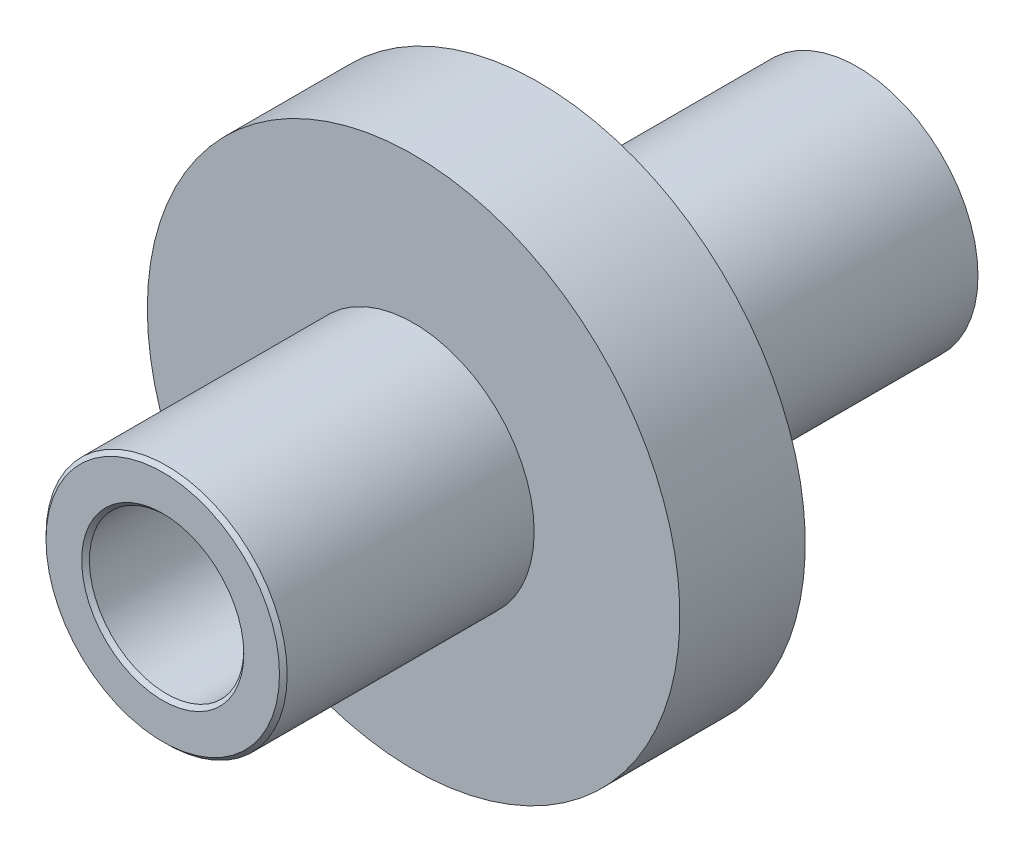
ISO-10303-21;
HEADER;
FILE_DESCRIPTION(('STEP AP214'),'2;1');
FILE_NAME('part.step','',(''),(''),'','','');
FILE_SCHEMA(('AUTOMOTIVE_DESIGN { 1 0 10303 214 1 1 1 1 }'));
ENDSEC;
DATA;
#1=APPLICATION_CONTEXT('core data for automotive mechanical design processes');
#2=APPLICATION_PROTOCOL_DEFINITION('international standard','automotive_design',2000,#1);
#3=PRODUCT_CONTEXT('',#1,'mechanical');
#4=PRODUCT('Part','Part','',(#3));
#5=PRODUCT_RELATED_PRODUCT_CATEGORY('part','',(#4));
#6=PRODUCT_DEFINITION_FORMATION('','',#4);
#7=PRODUCT_DEFINITION_CONTEXT('part definition',#1,'design');
#8=PRODUCT_DEFINITION('design','',#6,#7);
#9=PRODUCT_DEFINITION_SHAPE('','',#8);
#10=(LENGTH_UNIT() NAMED_UNIT(*) SI_UNIT(.MILLI.,.METRE.));
#11=(NAMED_UNIT(*) PLANE_ANGLE_UNIT() SI_UNIT($,.RADIAN.));
#12=(NAMED_UNIT(*) SI_UNIT($,.STERADIAN.) SOLID_ANGLE_UNIT());
#13=UNCERTAINTY_MEASURE_WITH_UNIT(LENGTH_MEASURE(1.E-05),#10,'distance_accuracy_value','');
#14=(GEOMETRIC_REPRESENTATION_CONTEXT(3) GLOBAL_UNCERTAINTY_ASSIGNED_CONTEXT((#13)) GLOBAL_UNIT_ASSIGNED_CONTEXT((#10,
#11,#12)) REPRESENTATION_CONTEXT('',''));
#15=CARTESIAN_POINT('',(0.,0.,0.));
#16=DIRECTION('',(0.,0.,1.));
#17=DIRECTION('',(1.,0.,0.));
#18=AXIS2_PLACEMENT_3D('',#15,#16,#17);
#19=CARTESIAN_POINT('',(0.,0.,6.5));
#20=DIRECTION('',(0.,0.,1.));
#21=DIRECTION('',(1.,0.,0.));
#22=AXIS2_PLACEMENT_3D('',#19,#20,#21);
#23=PLANE('',#22);
#24=CARTESIAN_POINT('',(0.,0.,6.5));
#25=DIRECTION('',(0.,0.,1.));
#26=DIRECTION('',(1.,0.,0.));
#27=AXIS2_PLACEMENT_3D('',#24,#25,#26);
#28=CIRCLE('',#27,6.25);
#29=CARTESIAN_POINT('',(6.25,0.,6.5));
#30=VERTEX_POINT('',#29);
#31=EDGE_CURVE('E103',#30,#30,#28,.T.);
#32=ORIENTED_EDGE('',*,*,#31,.F.);
#33=EDGE_LOOP('',(#32));
#34=FACE_BOUND('',#33,.T.);
#35=CARTESIAN_POINT('',(0.,0.,6.5));
#36=DIRECTION('',(0.,0.,1.));
#37=DIRECTION('',(1.,0.,0.));
#38=AXIS2_PLACEMENT_3D('',#35,#36,#37);
#39=CIRCLE('',#38,13.8);
#40=CARTESIAN_POINT('',(-13.8,0.,6.5));
#41=VERTEX_POINT('',#40);
#42=EDGE_CURVE('E107',#41,#41,#39,.T.);
#43=ORIENTED_EDGE('',*,*,#42,.T.);
#44=EDGE_LOOP('',(#43));
#45=FACE_BOUND('',#44,.T.);
#46=ADVANCED_FACE('F36',(#34,#45),#23,.T.);
#47=CARTESIAN_POINT('',(0.,0.,0.));
#48=DIRECTION('',(0.,0.,1.));
#49=DIRECTION('',(1.,0.,0.));
#50=AXIS2_PLACEMENT_3D('',#47,#48,#49);
#51=PLANE('',#50);
#52=CARTESIAN_POINT('',(0.,0.,0.));
#53=DIRECTION('',(0.,0.,1.));
#54=DIRECTION('',(1.,0.,0.));
#55=AXIS2_PLACEMENT_3D('',#52,#53,#54);
#56=CIRCLE('',#55,6.25);
#57=CARTESIAN_POINT('',(6.25,0.,0.));
#58=VERTEX_POINT('',#57);
#59=EDGE_CURVE('E102',#58,#58,#56,.T.);
#60=ORIENTED_EDGE('',*,*,#59,.T.);
#61=EDGE_LOOP('',(#60));
#62=FACE_BOUND('',#61,.T.);
#63=CARTESIAN_POINT('',(0.,0.,0.));
#64=DIRECTION('',(0.,0.,1.));
#65=DIRECTION('',(1.,0.,0.));
#66=AXIS2_PLACEMENT_3D('',#63,#64,#65);
#67=CIRCLE('',#66,13.8);
#68=CARTESIAN_POINT('',(-13.8,0.,0.));
#69=VERTEX_POINT('',#68);
#70=EDGE_CURVE('E110',#69,#69,#67,.T.);
#71=ORIENTED_EDGE('',*,*,#70,.F.);
#72=EDGE_LOOP('',(#71));
#73=FACE_BOUND('',#72,.T.);
#74=ADVANCED_FACE('F150',(#62,#73),#51,.F.);
#75=CARTESIAN_POINT('',(0.,0.,6.5));
#76=DIRECTION('',(0.,0.,-1.));
#77=DIRECTION('',(-1.,0.,0.));
#78=AXIS2_PLACEMENT_3D('',#75,#76,#77);
#79=CYLINDRICAL_SURFACE('',#78,13.8);
#80=CARTESIAN_POINT('',(-13.8,0.,6.5));
#81=CARTESIAN_POINT('',(-13.8,0.,6.43229166666667));
#82=CARTESIAN_POINT('',(-13.8,0.,6.36458333333333));
#83=CARTESIAN_POINT('',(-13.8,0.,6.22916666666667));
#84=CARTESIAN_POINT('',(-13.8,0.,6.16145833333333));
#85=CARTESIAN_POINT('',(-13.8,0.,6.02604166666667));
#86=CARTESIAN_POINT('',(-13.8,0.,5.95833333333333));
#87=CARTESIAN_POINT('',(-13.8,0.,5.82291666666667));
#88=CARTESIAN_POINT('',(-13.8,0.,5.75520833333333));
#89=CARTESIAN_POINT('',(-13.8,0.,5.61979166666667));
#90=CARTESIAN_POINT('',(-13.8,0.,5.55208333333333));
#91=CARTESIAN_POINT('',(-13.8,0.,5.41666666666667));
#92=CARTESIAN_POINT('',(-13.8,0.,5.34895833333333));
#93=CARTESIAN_POINT('',(-13.8,0.,5.21354166666667));
#94=CARTESIAN_POINT('',(-13.8,0.,5.14583333333333));
#95=CARTESIAN_POINT('',(-13.8,0.,5.01041666666667));
#96=CARTESIAN_POINT('',(-13.8,0.,4.94270833333333));
#97=CARTESIAN_POINT('',(-13.8,0.,4.80729166666667));
#98=CARTESIAN_POINT('',(-13.8,0.,4.73958333333333));
#99=CARTESIAN_POINT('',(-13.8,0.,4.60416666666667));
#100=CARTESIAN_POINT('',(-13.8,0.,4.53645833333333));
#101=CARTESIAN_POINT('',(-13.8,0.,4.40104166666667));
#102=CARTESIAN_POINT('',(-13.8,0.,4.33333333333333));
#103=CARTESIAN_POINT('',(-13.8,0.,4.19791666666667));
#104=CARTESIAN_POINT('',(-13.8,0.,4.13020833333333));
#105=CARTESIAN_POINT('',(-13.8,0.,3.99479166666667));
#106=CARTESIAN_POINT('',(-13.8,0.,3.92708333333333));
#107=CARTESIAN_POINT('',(-13.8,0.,3.79166666666667));
#108=CARTESIAN_POINT('',(-13.8,0.,3.72395833333333));
#109=CARTESIAN_POINT('',(-13.8,0.,3.58854166666667));
#110=CARTESIAN_POINT('',(-13.8,0.,3.52083333333333));
#111=CARTESIAN_POINT('',(-13.8,0.,3.38541666666667));
#112=CARTESIAN_POINT('',(-13.8,0.,3.31770833333333));
#113=CARTESIAN_POINT('',(-13.8,0.,3.18229166666667));
#114=CARTESIAN_POINT('',(-13.8,0.,3.11458333333333));
#115=CARTESIAN_POINT('',(-13.8,0.,2.97916666666667));
#116=CARTESIAN_POINT('',(-13.8,0.,2.91145833333333));
#117=CARTESIAN_POINT('',(-13.8,0.,2.77604166666667));
#118=CARTESIAN_POINT('',(-13.8,0.,2.70833333333333));
#119=CARTESIAN_POINT('',(-13.8,0.,2.57291666666667));
#120=CARTESIAN_POINT('',(-13.8,0.,2.50520833333333));
#121=CARTESIAN_POINT('',(-13.8,0.,2.36979166666667));
#122=CARTESIAN_POINT('',(-13.8,0.,2.30208333333333));
#123=CARTESIAN_POINT('',(-13.8,0.,2.16666666666667));
#124=CARTESIAN_POINT('',(-13.8,0.,2.09895833333333));
#125=CARTESIAN_POINT('',(-13.8,0.,1.96354166666667));
#126=CARTESIAN_POINT('',(-13.8,0.,1.89583333333333));
#127=CARTESIAN_POINT('',(-13.8,0.,1.76041666666667));
#128=CARTESIAN_POINT('',(-13.8,0.,1.69270833333333));
#129=CARTESIAN_POINT('',(-13.8,0.,1.55729166666667));
#130=CARTESIAN_POINT('',(-13.8,0.,1.48958333333333));
#131=CARTESIAN_POINT('',(-13.8,0.,1.35416666666667));
#132=CARTESIAN_POINT('',(-13.8,0.,1.28645833333333));
#133=CARTESIAN_POINT('',(-13.8,0.,1.15104166666667));
#134=CARTESIAN_POINT('',(-13.8,0.,1.08333333333333));
#135=CARTESIAN_POINT('',(-13.8,0.,0.947916666666667));
#136=CARTESIAN_POINT('',(-13.8,0.,0.880208333333333));
#137=CARTESIAN_POINT('',(-13.8,0.,0.744791666666667));
#138=CARTESIAN_POINT('',(-13.8,0.,0.677083333333333));
#139=CARTESIAN_POINT('',(-13.8,0.,0.541666666666667));
#140=CARTESIAN_POINT('',(-13.8,0.,0.473958333333333));
#141=CARTESIAN_POINT('',(-13.8,0.,0.338541666666667));
#142=CARTESIAN_POINT('',(-13.8,0.,0.270833333333334));
#143=CARTESIAN_POINT('',(-13.8,0.,0.135416666666667));
#144=CARTESIAN_POINT('',(-13.8,0.,0.0677083333333334));
#145=CARTESIAN_POINT('',(-13.8,0.,0.));
#146=B_SPLINE_CURVE_WITH_KNOTS('',3,(#80,#81,#82,#83,#84,#85,#86,#87,#88,#89,#90,#91,#92,#93,
#94,#95,#96,#97,#98,#99,#100,#101,#102,#103,#104,#105,#106,#107,#108,#109,#110,#111,#112,#113,
#114,#115,#116,#117,#118,#119,#120,#121,#122,#123,#124,#125,#126,#127,#128,#129,#130,#131,#132,
#133,#134,#135,#136,#137,#138,#139,#140,#141,#142,#143,#144,#145),.UNSPECIFIED.,.F.,.F.,(4,2,2,
2,2,2,2,2,2,2,2,2,2,2,2,2,2,2,2,2,2,2,2,2,2,2,2,2,2,2,2,2,4),(0.,0.203124999999999,0.40625,
0.609375,0.812499999999999,1.015625,1.21875,1.421875,1.625,1.828125,2.03125,2.234375,2.4375,
2.640625,2.84375,3.046875,3.25,3.453125,3.65625,3.859375,4.0625,4.265625,4.46875,4.671875,4.875,
5.078125,5.28125,5.484375,5.6875,5.890625,6.09375,6.296875,6.5),.UNSPECIFIED.);
#147=EDGE_CURVE('BSEAM146',#41,#69,#146,.T.);
#148=ORIENTED_EDGE('',*,*,#42,.F.);
#149=ORIENTED_EDGE('',*,*,#70,.T.);
#150=ORIENTED_EDGE('',*,*,#147,.T.);
#151=ORIENTED_EDGE('',*,*,#147,.F.);
#152=EDGE_LOOP('',(#148,#150,#149,#151));
#153=FACE_BOUND('',#152,.T.);
#154=ADVANCED_FACE('F146',(#153),#79,.T.);
#155=CARTESIAN_POINT('',(0.,0.,-16.5));
#156=DIRECTION('',(0.,0.,1.));
#157=DIRECTION('',(1.,0.,0.));
#158=AXIS2_PLACEMENT_3D('',#155,#156,#157);
#159=CYLINDRICAL_SURFACE('',#158,6.25);
#160=CARTESIAN_POINT('',(0.,0.,-16.5));
#161=DIRECTION('',(0.,0.,1.));
#162=DIRECTION('',(1.,0.,0.));
#163=AXIS2_PLACEMENT_3D('',#160,#161,#162);
#164=CIRCLE('',#163,6.25);
#165=CARTESIAN_POINT('',(6.25,0.,-16.5));
#166=VERTEX_POINT('',#165);
#167=EDGE_CURVE('E98',#166,#166,#164,.T.);
#168=ORIENTED_EDGE('',*,*,#167,.T.);
#169=EDGE_LOOP('',(#168));
#170=FACE_BOUND('',#169,.T.);
#171=ORIENTED_EDGE('',*,*,#59,.F.);
#172=EDGE_LOOP('',(#171));
#173=FACE_BOUND('',#172,.T.);
#174=ADVANCED_FACE('F149',(#170,#173),#159,.T.);
#175=CARTESIAN_POINT('',(0.,0.,-16.5));
#176=DIRECTION('',(0.,0.,1.));
#177=DIRECTION('',(1.,0.,0.));
#178=AXIS2_PLACEMENT_3D('',#175,#176,#177);
#179=PLANE('',#178);
#180=DIRECTION('',(1.,0.,0.));
#181=VECTOR('',#180,1.);
#182=CARTESIAN_POINT('',(3.46410161513775,-2.2,-16.5));
#183=LINE('',#182,#181);
#184=CARTESIAN_POINT('',(-3.57770876399966,-2.2,-16.5));
#185=VERTEX_POINT('',#184);
#186=CARTESIAN_POINT('',(3.57770876399966,-2.2,-16.5));
#187=VERTEX_POINT('',#186);
#188=EDGE_CURVE('E57',#185,#187,#183,.T.);
#189=ORIENTED_EDGE('',*,*,#188,.T.);
#190=CARTESIAN_POINT('',(0.,0.,-16.5));
#191=DIRECTION('',(0.,0.,1.));
#192=DIRECTION('',(1.,0.,0.));
#193=AXIS2_PLACEMENT_3D('',#190,#191,#192);
#194=CIRCLE('',#193,4.2);
#195=EDGE_CURVE('E50',#187,#185,#194,.T.);
#196=ORIENTED_EDGE('',*,*,#195,.T.);
#197=EDGE_LOOP('',(#189,#196));
#198=FACE_BOUND('',#197,.T.);
#199=ORIENTED_EDGE('',*,*,#167,.F.);
#200=EDGE_LOOP('',(#199));
#201=FACE_BOUND('',#200,.T.);
#202=ADVANCED_FACE('F161',(#198,#201),#179,.F.);
#203=CARTESIAN_POINT('',(0.,0.,6.5));
#204=DIRECTION('',(0.,0.,-1.));
#205=DIRECTION('',(-1.,0.,0.));
#206=AXIS2_PLACEMENT_3D('',#203,#204,#205);
#207=CYLINDRICAL_SURFACE('',#206,4.);
#208=CARTESIAN_POINT('',(0.,0.,19.3));
#209=DIRECTION('',(0.,0.,1.));
#210=DIRECTION('',(1.,0.,0.));
#211=AXIS2_PLACEMENT_3D('',#208,#209,#210);
#212=CIRCLE('',#211,4.);
#213=CARTESIAN_POINT('',(4.,0.,19.3));
#214=VERTEX_POINT('',#213);
#215=EDGE_CURVE('E125',#214,#214,#212,.T.);
#216=ORIENTED_EDGE('',*,*,#215,.T.);
#217=EDGE_LOOP('',(#216));
#218=FACE_BOUND('',#217,.T.);
#219=DIRECTION('',(0.,0.,-1.));
#220=VECTOR('',#219,1.);
#221=CARTESIAN_POINT('',(-3.46410161513775,-2.,-8.5));
#222=LINE('',#221,#220);
#223=CARTESIAN_POINT('',(-3.46410161513775,-2.,-8.5));
#224=VERTEX_POINT('',#223);
#225=CARTESIAN_POINT('',(-3.46410161513775,-2.,-16.3));
#226=VERTEX_POINT('',#225);
#227=EDGE_CURVE('E79',#224,#226,#222,.T.);
#228=ORIENTED_EDGE('',*,*,#227,.T.);
#229=CARTESIAN_POINT('',(0.,0.,-16.3));
#230=DIRECTION('',(0.,0.,1.));
#231=DIRECTION('',(1.,0.,0.));
#232=AXIS2_PLACEMENT_3D('',#229,#230,#231);
#233=CIRCLE('',#232,4.);
#234=CARTESIAN_POINT('',(3.46410161513775,-2.,-16.3));
#235=VERTEX_POINT('',#234);
#236=EDGE_CURVE('E123',#226,#235,#233,.F.);
#237=ORIENTED_EDGE('',*,*,#236,.T.);
#238=DIRECTION('',(0.,0.,-1.));
#239=VECTOR('',#238,1.);
#240=CARTESIAN_POINT('',(3.46410161513775,-2.,-8.5));
#241=LINE('',#240,#239);
#242=CARTESIAN_POINT('',(3.46410161513775,-2.,-8.5));
#243=VERTEX_POINT('',#242);
#244=EDGE_CURVE('E89',#243,#235,#241,.T.);
#245=ORIENTED_EDGE('',*,*,#244,.F.);
#246=CARTESIAN_POINT('',(0.,0.,-8.5));
#247=DIRECTION('',(0.,0.,-1.));
#248=DIRECTION('',(-1.,0.,0.));
#249=AXIS2_PLACEMENT_3D('',#246,#247,#248);
#250=CIRCLE('',#249,4.);
#251=EDGE_CURVE('E93',#243,#224,#250,.T.);
#252=ORIENTED_EDGE('',*,*,#251,.T.);
#253=EDGE_LOOP('',(#228,#237,#245,#252));
#254=FACE_BOUND('',#253,.T.);
#255=ADVANCED_FACE('F95',(#218,#254),#207,.F.);
#256=CARTESIAN_POINT('',(0.,0.,19.3));
#257=DIRECTION('',(0.,0.,1.));
#258=DIRECTION('',(1.,0.,0.));
#259=AXIS2_PLACEMENT_3D('',#256,#257,#258);
#260=CIRCLE('',#259,6.25);
#261=CARTESIAN_POINT('',(6.25,0.,19.3));
#262=VERTEX_POINT('',#261);
#263=EDGE_CURVE('E120',#262,#262,#260,.F.);
#264=ORIENTED_EDGE('',*,*,#263,.T.);
#265=EDGE_LOOP('',(#264));
#266=FACE_BOUND('',#265,.T.);
#267=ORIENTED_EDGE('',*,*,#31,.T.);
#268=EDGE_LOOP('',(#267));
#269=FACE_BOUND('',#268,.T.);
#270=ADVANCED_FACE('F160',(#266,#269),#159,.T.);
#271=CARTESIAN_POINT('',(0.,0.,19.5));
#272=DIRECTION('',(0.,0.,1.));
#273=DIRECTION('',(1.,0.,0.));
#274=AXIS2_PLACEMENT_3D('',#271,#272,#273);
#275=PLANE('',#274);
#276=CARTESIAN_POINT('',(0.,0.,19.5));
#277=DIRECTION('',(0.,0.,1.));
#278=DIRECTION('',(1.,0.,0.));
#279=AXIS2_PLACEMENT_3D('',#276,#277,#278);
#280=CIRCLE('',#279,6.05000000000001);
#281=CARTESIAN_POINT('',(6.05000000000001,0.,19.5));
#282=VERTEX_POINT('',#281);
#283=EDGE_CURVE('E117',#282,#282,#280,.T.);
#284=ORIENTED_EDGE('',*,*,#283,.T.);
#285=EDGE_LOOP('',(#284));
#286=FACE_BOUND('',#285,.T.);
#287=CARTESIAN_POINT('',(0.,0.,19.5));
#288=DIRECTION('',(0.,0.,1.));
#289=DIRECTION('',(1.,0.,0.));
#290=AXIS2_PLACEMENT_3D('',#287,#288,#289);
#291=CIRCLE('',#290,4.20000000000004);
#292=CARTESIAN_POINT('',(4.20000000000004,0.,19.5));
#293=VERTEX_POINT('',#292);
#294=EDGE_CURVE('E106',#293,#293,#291,.F.);
#295=ORIENTED_EDGE('',*,*,#294,.T.);
#296=EDGE_LOOP('',(#295));
#297=FACE_BOUND('',#296,.T.);
#298=ADVANCED_FACE('F165',(#286,#297),#275,.T.);
#299=CARTESIAN_POINT('',(3.46410161513775,-2.,-8.5));
#300=DIRECTION('',(0.,1.,0.));
#301=DIRECTION('',(0.,0.,1.));
#302=AXIS2_PLACEMENT_3D('',#299,#300,#301);
#303=PLANE('',#302);
#304=ORIENTED_EDGE('',*,*,#244,.T.);
#305=DIRECTION('',(-1.,0.,0.));
#306=VECTOR('',#305,1.);
#307=CARTESIAN_POINT('',(-3.46410161513775,-2.,-16.3));
#308=LINE('',#307,#306);
#309=EDGE_CURVE('E11',#235,#226,#308,.T.);
#310=ORIENTED_EDGE('',*,*,#309,.T.);
#311=ORIENTED_EDGE('',*,*,#227,.F.);
#312=DIRECTION('',(1.,0.,0.));
#313=VECTOR('',#312,1.);
#314=CARTESIAN_POINT('',(3.46410161513775,-2.,-8.5));
#315=LINE('',#314,#313);
#316=EDGE_CURVE('E83',#224,#243,#315,.T.);
#317=ORIENTED_EDGE('',*,*,#316,.T.);
#318=EDGE_LOOP('',(#304,#310,#311,#317));
#319=FACE_BOUND('',#318,.T.);
#320=ADVANCED_FACE('F82',(#319),#303,.T.);
#321=CARTESIAN_POINT('',(0.,0.,-8.5));
#322=DIRECTION('',(0.,0.,-1.));
#323=DIRECTION('',(-1.,0.,0.));
#324=AXIS2_PLACEMENT_3D('',#321,#322,#323);
#325=PLANE('',#324);
#326=ORIENTED_EDGE('',*,*,#251,.F.);
#327=ORIENTED_EDGE('',*,*,#316,.F.);
#328=EDGE_LOOP('',(#326,#327));
#329=FACE_BOUND('',#328,.T.);
#330=ADVANCED_FACE('F92',(#329),#325,.F.);
#331=CARTESIAN_POINT('',(0.,0.,19.5));
#332=DIRECTION('',(0.,0.,-1.));
#333=DIRECTION('',(-1.,0.,0.));
#334=AXIS2_PLACEMENT_3D('',#331,#332,#333);
#335=CONICAL_SURFACE('',#334,6.05000000000001,0.785398163397455);
#336=ORIENTED_EDGE('',*,*,#263,.F.);
#337=EDGE_LOOP('',(#336));
#338=FACE_BOUND('',#337,.T.);
#339=ORIENTED_EDGE('',*,*,#283,.F.);
#340=EDGE_LOOP('',(#339));
#341=FACE_BOUND('',#340,.T.);
#342=ADVANCED_FACE('F141',(#338,#341),#335,.T.);
#343=CARTESIAN_POINT('',(0.,0.,19.3));
#344=DIRECTION('',(0.,0.,1.));
#345=DIRECTION('',(1.,0.,0.));
#346=AXIS2_PLACEMENT_3D('',#343,#344,#345);
#347=CONICAL_SURFACE('',#346,4.,0.785398163397446);
#348=CARTESIAN_POINT('',(4.20000000000004,0.,19.5));
#349=CARTESIAN_POINT('',(4.19791666666671,0.,19.4979166666667));
#350=CARTESIAN_POINT('',(4.19583333333337,0.,19.4958333333333));
#351=CARTESIAN_POINT('',(4.19166666666671,0.,19.4916666666667));
#352=CARTESIAN_POINT('',(4.18958333333337,0.,19.4895833333333));
#353=CARTESIAN_POINT('',(4.1854166666667,0.,19.4854166666667));
#354=CARTESIAN_POINT('',(4.18333333333337,0.,19.4833333333333));
#355=CARTESIAN_POINT('',(4.1791666666667,0.,19.4791666666667));
#356=CARTESIAN_POINT('',(4.17708333333337,0.,19.4770833333333));
#357=CARTESIAN_POINT('',(4.1729166666667,0.,19.4729166666667));
#358=CARTESIAN_POINT('',(4.17083333333337,0.,19.4708333333333));
#359=CARTESIAN_POINT('',(4.1666666666667,0.,19.4666666666667));
#360=CARTESIAN_POINT('',(4.16458333333337,0.,19.4645833333333));
#361=CARTESIAN_POINT('',(4.1604166666667,0.,19.4604166666667));
#362=CARTESIAN_POINT('',(4.15833333333337,0.,19.4583333333333));
#363=CARTESIAN_POINT('',(4.1541666666667,0.,19.4541666666667));
#364=CARTESIAN_POINT('',(4.15208333333336,0.,19.4520833333333));
#365=CARTESIAN_POINT('',(4.1479166666667,0.,19.4479166666667));
#366=CARTESIAN_POINT('',(4.14583333333336,0.,19.4458333333333));
#367=CARTESIAN_POINT('',(4.1416666666667,0.,19.4416666666667));
#368=CARTESIAN_POINT('',(4.13958333333336,0.,19.4395833333333));
#369=CARTESIAN_POINT('',(4.13541666666669,0.,19.4354166666667));
#370=CARTESIAN_POINT('',(4.13333333333336,0.,19.4333333333333));
#371=CARTESIAN_POINT('',(4.12916666666669,0.,19.4291666666666));
#372=CARTESIAN_POINT('',(4.12708333333336,0.,19.4270833333333));
#373=CARTESIAN_POINT('',(4.12291666666669,0.,19.4229166666666));
#374=CARTESIAN_POINT('',(4.12083333333336,0.,19.4208333333333));
#375=CARTESIAN_POINT('',(4.11666666666669,0.,19.4166666666666));
#376=CARTESIAN_POINT('',(4.11458333333336,0.,19.4145833333333));
#377=CARTESIAN_POINT('',(4.11041666666669,0.,19.4104166666666));
#378=CARTESIAN_POINT('',(4.10833333333335,0.,19.4083333333333));
#379=CARTESIAN_POINT('',(4.10416666666669,0.,19.4041666666666));
#380=CARTESIAN_POINT('',(4.10208333333335,0.,19.4020833333333));
#381=CARTESIAN_POINT('',(4.09791666666669,0.,19.3979166666666));
#382=CARTESIAN_POINT('',(4.09583333333335,0.,19.3958333333333));
#383=CARTESIAN_POINT('',(4.09166666666668,0.,19.3916666666666));
#384=CARTESIAN_POINT('',(4.08958333333335,0.,19.3895833333333));
#385=CARTESIAN_POINT('',(4.08541666666668,0.,19.3854166666666));
#386=CARTESIAN_POINT('',(4.08333333333335,0.,19.3833333333333));
#387=CARTESIAN_POINT('',(4.07916666666668,0.,19.3791666666666));
#388=CARTESIAN_POINT('',(4.07708333333335,0.,19.3770833333333));
#389=CARTESIAN_POINT('',(4.07291666666668,0.,19.3729166666666));
#390=CARTESIAN_POINT('',(4.07083333333335,0.,19.3708333333333));
#391=CARTESIAN_POINT('',(4.06666666666668,0.,19.3666666666666));
#392=CARTESIAN_POINT('',(4.06458333333335,0.,19.3645833333333));
#393=CARTESIAN_POINT('',(4.06041666666668,0.,19.3604166666666));
#394=CARTESIAN_POINT('',(4.05833333333334,0.,19.3583333333333));
#395=CARTESIAN_POINT('',(4.05416666666668,0.,19.3541666666666));
#396=CARTESIAN_POINT('',(4.05208333333334,0.,19.3520833333333));
#397=CARTESIAN_POINT('',(4.04791666666668,0.,19.3479166666666));
#398=CARTESIAN_POINT('',(4.04583333333334,0.,19.3458333333333));
#399=CARTESIAN_POINT('',(4.04166666666667,0.,19.3416666666666));
#400=CARTESIAN_POINT('',(4.03958333333334,0.,19.3395833333333));
#401=CARTESIAN_POINT('',(4.03541666666667,0.,19.3354166666666));
#402=CARTESIAN_POINT('',(4.03333333333334,0.,19.3333333333333));
#403=CARTESIAN_POINT('',(4.02916666666667,0.,19.3291666666666));
#404=CARTESIAN_POINT('',(4.02708333333334,0.,19.3270833333333));
#405=CARTESIAN_POINT('',(4.02291666666667,0.,19.3229166666666));
#406=CARTESIAN_POINT('',(4.02083333333334,0.,19.3208333333333));
#407=CARTESIAN_POINT('',(4.01666666666667,0.,19.3166666666666));
#408=CARTESIAN_POINT('',(4.01458333333334,0.,19.3145833333333));
#409=CARTESIAN_POINT('',(4.01041666666667,0.,19.3104166666666));
#410=CARTESIAN_POINT('',(4.00833333333333,0.,19.3083333333333));
#411=CARTESIAN_POINT('',(4.00416666666667,0.,19.3041666666666));
#412=CARTESIAN_POINT('',(4.00208333333333,0.,19.3020833333333));
#413=CARTESIAN_POINT('',(4.,0.,19.3));
#414=B_SPLINE_CURVE_WITH_KNOTS('',3,(#348,#349,#350,#351,#352,#353,#354,#355,#356,#357,#358,
#359,#360,#361,#362,#363,#364,#365,#366,#367,#368,#369,#370,#371,#372,#373,#374,#375,#376,#377,
#378,#379,#380,#381,#382,#383,#384,#385,#386,#387,#388,#389,#390,#391,#392,#393,#394,#395,#396,
#397,#398,#399,#400,#401,#402,#403,#404,#405,#406,#407,#408,#409,#410,#411,#412,#413),
.UNSPECIFIED.,.F.,.F.,(4,2,2,2,2,2,2,2,2,2,2,2,2,2,2,2,2,2,2,2,2,2,2,2,2,2,2,2,2,2,2,2,4),(0.,
0.00883883476483455,0.0176776695296697,0.0265165042945018,0.0353553390593364,0.0441941738241691,
0.0530330085890036,0.0618718433538382,0.0707106781186709,0.0795495128835054,0.0883883476483375,
0.0972271824131727,0.106066017178007,0.114904851942839,0.123743686707674,0.132582521472507,
0.141421356237341,0.150260191002176,0.159099025767008,0.167937860531844,0.176776695296676,
0.18561553006151,0.194454364826345,0.203293199591177,0.212132034356012,0.220970869120845,
0.229809703885679,0.238648538650514,0.247487373415347,0.256326208180181,0.265165042945013,
0.274003877709848,0.28284271247468),.UNSPECIFIED.);
#415=EDGE_CURVE('BSEAM137',#293,#214,#414,.T.);
#416=ORIENTED_EDGE('',*,*,#294,.F.);
#417=ORIENTED_EDGE('',*,*,#215,.F.);
#418=ORIENTED_EDGE('',*,*,#415,.T.);
#419=ORIENTED_EDGE('',*,*,#415,.F.);
#420=EDGE_LOOP('',(#416,#418,#417,#419));
#421=FACE_BOUND('',#420,.T.);
#422=ADVANCED_FACE('F137',(#421),#347,.F.);
#423=CARTESIAN_POINT('',(0.,-2.2,-16.5));
#424=DIRECTION('',(0.,0.707106781186548,-0.707106781186548));
#425=DIRECTION('',(-1.,0.,0.));
#426=AXIS2_PLACEMENT_3D('',#423,#424,#425);
#427=PLANE('',#426);
#428=CARTESIAN_POINT('',(-3.57770876399966,-2.2,-16.5));
#429=CARTESIAN_POINT('',(-3.55903726849498,-2.16659196899255,-16.4665919689926));
#430=CARTESIAN_POINT('',(-3.54023426015984,-2.13322128997931,-16.4332212899793));
#431=CARTESIAN_POINT('',(-3.50236521063908,-2.06655462328427,-16.3665546232843));
#432=CARTESIAN_POINT('',(-3.48329916935358,-2.03325863563085,-16.3332586356309));
#433=CARTESIAN_POINT('',(-3.46410161513776,-2.,-16.3));
#434=B_SPLINE_CURVE_WITH_KNOTS('',3,(#428,#429,#430,#431,#432,#433),.UNSPECIFIED.,.F.,.F.,(4,2,
4),(0.,0.152403471163053,0.304807000195057),.UNSPECIFIED.);
#435=EDGE_CURVE('E65',#226,#185,#434,.F.);
#436=ORIENTED_EDGE('',*,*,#435,.F.);
#437=ORIENTED_EDGE('',*,*,#309,.F.);
#438=CARTESIAN_POINT('',(3.46410161513775,-2.,-16.3));
#439=CARTESIAN_POINT('',(3.48329916935358,-2.03325863563085,-16.3332586356309));
#440=CARTESIAN_POINT('',(3.50236521063908,-2.06655462328427,-16.3665546232843));
#441=CARTESIAN_POINT('',(3.54023426015984,-2.13322128997931,-16.4332212899793));
#442=CARTESIAN_POINT('',(3.55903726849498,-2.16659196899255,-16.4665919689926));
#443=CARTESIAN_POINT('',(3.57770876399966,-2.2,-16.5));
#444=B_SPLINE_CURVE_WITH_KNOTS('',3,(#438,#439,#440,#441,#442,#443),.UNSPECIFIED.,.F.,.F.,(4,2,
4),(0.,0.152403529032006,0.304807000195059),.UNSPECIFIED.);
#445=EDGE_CURVE('E41',#187,#235,#444,.F.);
#446=ORIENTED_EDGE('',*,*,#445,.F.);
#447=ORIENTED_EDGE('',*,*,#188,.F.);
#448=EDGE_LOOP('',(#436,#437,#446,#447));
#449=FACE_BOUND('',#448,.T.);
#450=ADVANCED_FACE('F38',(#449),#427,.T.);
#451=CARTESIAN_POINT('',(0.,0.,-16.5));
#452=DIRECTION('',(0.,0.,-1.));
#453=DIRECTION('',(-1.,0.,0.));
#454=AXIS2_PLACEMENT_3D('',#451,#452,#453);
#455=CONICAL_SURFACE('',#454,4.2,0.785398163397448);
#456=ORIENTED_EDGE('',*,*,#445,.T.);
#457=ORIENTED_EDGE('',*,*,#236,.F.);
#458=ORIENTED_EDGE('',*,*,#435,.T.);
#459=ORIENTED_EDGE('',*,*,#195,.F.);
#460=EDGE_LOOP('',(#456,#457,#458,#459));
#461=FACE_BOUND('',#460,.T.);
#462=ADVANCED_FACE('F133',(#461),#455,.F.);
#463=CLOSED_SHELL('',(#46,#74,#154,#174,#202,#255,#270,#298,#320,#330,#342,#422,#450,#462));
#464=MANIFOLD_SOLID_BREP('B2',#463);
#465=ADVANCED_BREP_SHAPE_REPRESENTATION('',(#18,#464),#14);
#466=SHAPE_DEFINITION_REPRESENTATION(#9,#465);
ENDSEC;
END-ISO-10303-21;
